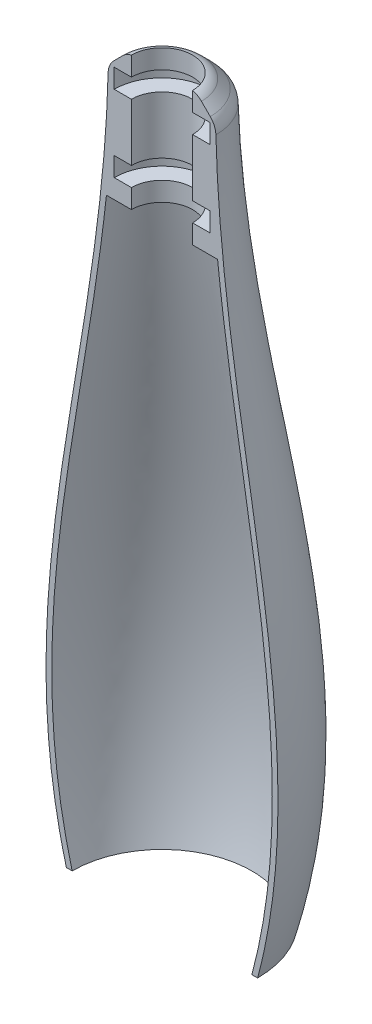
ISO-10303-21;
HEADER;
FILE_DESCRIPTION(('STEP AP214'),'2;1');
FILE_NAME('part.step','',(''),(''),'','','');
FILE_SCHEMA(('AUTOMOTIVE_DESIGN { 1 0 10303 214 1 1 1 1 }'));
ENDSEC;
DATA;
#1=APPLICATION_CONTEXT('core data for automotive mechanical design processes');
#2=APPLICATION_PROTOCOL_DEFINITION('international standard','automotive_design',2000,#1);
#3=PRODUCT_CONTEXT('',#1,'mechanical');
#4=PRODUCT('Part','Part','',(#3));
#5=PRODUCT_RELATED_PRODUCT_CATEGORY('part','',(#4));
#6=PRODUCT_DEFINITION_FORMATION('','',#4);
#7=PRODUCT_DEFINITION_CONTEXT('part definition',#1,'design');
#8=PRODUCT_DEFINITION('design','',#6,#7);
#9=PRODUCT_DEFINITION_SHAPE('','',#8);
#10=(LENGTH_UNIT() NAMED_UNIT(*) SI_UNIT(.MILLI.,.METRE.));
#11=(NAMED_UNIT(*) PLANE_ANGLE_UNIT() SI_UNIT($,.RADIAN.));
#12=(NAMED_UNIT(*) SI_UNIT($,.STERADIAN.) SOLID_ANGLE_UNIT());
#13=UNCERTAINTY_MEASURE_WITH_UNIT(LENGTH_MEASURE(1.E-05),#10,'distance_accuracy_value','');
#14=(GEOMETRIC_REPRESENTATION_CONTEXT(3) GLOBAL_UNCERTAINTY_ASSIGNED_CONTEXT((#13)) GLOBAL_UNIT_ASSIGNED_CONTEXT((#10,
#11,#12)) REPRESENTATION_CONTEXT('',''));
#15=CARTESIAN_POINT('',(0.,0.,0.));
#16=DIRECTION('',(0.,0.,1.));
#17=DIRECTION('',(1.,0.,0.));
#18=AXIS2_PLACEMENT_3D('',#15,#16,#17);
#19=CARTESIAN_POINT('',(0.,-350.,0.));
#20=DIRECTION('',(0.,-1.,0.));
#21=DIRECTION('',(1.,0.,0.));
#22=AXIS2_PLACEMENT_3D('',#19,#20,#21);
#23=PLANE('',#22);
#24=CARTESIAN_POINT('',(0.,-350.,0.));
#25=DIRECTION('',(0.,1.,0.));
#26=DIRECTION('',(-1.,0.,0.));
#27=AXIS2_PLACEMENT_3D('',#24,#25,#26);
#28=CIRCLE('',#27,50.);
#29=CARTESIAN_POINT('',(50.,-350.,0.));
#30=VERTEX_POINT('',#29);
#31=CARTESIAN_POINT('',(-50.,-350.,0.));
#32=VERTEX_POINT('',#31);
#33=EDGE_CURVE('E161',#30,#32,#28,.T.);
#34=ORIENTED_EDGE('',*,*,#33,.F.);
#35=DIRECTION('',(-1.,0.,0.));
#36=VECTOR('',#35,1.);
#37=CARTESIAN_POINT('',(70.,-350.,0.));
#38=LINE('',#37,#36);
#39=CARTESIAN_POINT('',(47.,-350.,0.));
#40=VERTEX_POINT('',#39);
#41=EDGE_CURVE('E153',#30,#40,#38,.T.);
#42=ORIENTED_EDGE('',*,*,#41,.T.);
#43=CARTESIAN_POINT('',(0.,-350.,0.));
#44=DIRECTION('',(0.,1.,0.));
#45=DIRECTION('',(-1.,0.,0.));
#46=AXIS2_PLACEMENT_3D('',#43,#44,#45);
#47=CIRCLE('',#46,47.);
#48=CARTESIAN_POINT('',(-47.,-350.,0.));
#49=VERTEX_POINT('',#48);
#50=EDGE_CURVE('E166',#40,#49,#47,.T.);
#51=ORIENTED_EDGE('',*,*,#50,.T.);
#52=EDGE_CURVE('E169',#49,#32,#38,.T.);
#53=ORIENTED_EDGE('',*,*,#52,.T.);
#54=EDGE_LOOP('',(#34,#42,#51,#53));
#55=FACE_BOUND('',#54,.T.);
#56=ADVANCED_FACE('F34',(#55),#23,.T.);
#57=CARTESIAN_POINT('',(-47.,-350.,0.));
#58=CARTESIAN_POINT('',(-74.6273831944322,-246.893202238206,0.));
#59=CARTESIAN_POINT('',(-41.1992508335811,-146.705952206088,0.));
#60=CARTESIAN_POINT('',(-29.0670337252442,-34.9999999999999,0.));
#61=B_SPLINE_CURVE_WITH_KNOTS('',3,(#57,#58,#59,#60),.UNSPECIFIED.,.F.,.F.,(4,4),(0.,
0.830416842574623),.UNSPECIFIED.);
#62=CARTESIAN_POINT('',(0.,50.,0.));
#63=DIRECTION('',(0.,1.,0.));
#64=AXIS1_PLACEMENT('',#62,#63);
#65=SURFACE_OF_REVOLUTION('',#61,#64);
#66=ORIENTED_EDGE('',*,*,#50,.F.);
#67=CARTESIAN_POINT('',(47.,-350.,0.));
#68=CARTESIAN_POINT('',(74.6273831944323,-246.893202238206,0.));
#69=CARTESIAN_POINT('',(41.1992508335812,-146.705952206088,0.));
#70=CARTESIAN_POINT('',(29.0670337252442,-34.9999999999999,0.));
#71=B_SPLINE_CURVE_WITH_KNOTS('',3,(#67,#68,#69,#70),.UNSPECIFIED.,.F.,.F.,(4,4),(0.,
0.830416842574623),.UNSPECIFIED.);
#72=CARTESIAN_POINT('',(29.0670337252442,-35.,0.));
#73=VERTEX_POINT('',#72);
#74=EDGE_CURVE('E149',#40,#73,#71,.T.);
#75=ORIENTED_EDGE('',*,*,#74,.T.);
#76=CARTESIAN_POINT('',(0.,-35.,0.));
#77=DIRECTION('',(0.,1.,0.));
#78=DIRECTION('',(-1.,0.,0.));
#79=AXIS2_PLACEMENT_3D('',#76,#77,#78);
#80=CIRCLE('',#79,29.0670337252442);
#81=CARTESIAN_POINT('',(-29.0670337252442,-35.,0.));
#82=VERTEX_POINT('',#81);
#83=EDGE_CURVE('E175',#73,#82,#80,.T.);
#84=ORIENTED_EDGE('',*,*,#83,.T.);
#85=CARTESIAN_POINT('',(-47.,-350.,0.));
#86=CARTESIAN_POINT('',(-74.6273831944322,-246.893202238206,0.));
#87=CARTESIAN_POINT('',(-41.1992508335811,-146.705952206088,0.));
#88=CARTESIAN_POINT('',(-29.0670337252442,-34.9999999999999,0.));
#89=B_SPLINE_CURVE_WITH_KNOTS('',3,(#85,#86,#87,#88),.UNSPECIFIED.,.F.,.F.,(4,4),(0.,
0.830416842574623),.UNSPECIFIED.);
#90=EDGE_CURVE('E173',#82,#49,#89,.F.);
#91=ORIENTED_EDGE('',*,*,#90,.T.);
#92=EDGE_LOOP('',(#66,#75,#84,#91));
#93=FACE_BOUND('',#92,.T.);
#94=ADVANCED_FACE('F172',(#93),#65,.F.);
#95=CARTESIAN_POINT('',(0.,-35.,0.));
#96=DIRECTION('',(0.,1.,0.));
#97=DIRECTION('',(-1.,0.,0.));
#98=AXIS2_PLACEMENT_3D('',#95,#96,#97);
#99=PLANE('',#98);
#100=DIRECTION('',(1.,0.,0.));
#101=VECTOR('',#100,1.);
#102=CARTESIAN_POINT('',(0.,-35.,0.));
#103=LINE('',#102,#101);
#104=CARTESIAN_POINT('',(-16.,-35.,0.));
#105=VERTEX_POINT('',#104);
#106=EDGE_CURVE('E255',#82,#105,#103,.T.);
#107=ORIENTED_EDGE('',*,*,#106,.F.);
#108=ORIENTED_EDGE('',*,*,#83,.F.);
#109=CARTESIAN_POINT('',(16.,-35.,0.));
#110=VERTEX_POINT('',#109);
#111=EDGE_CURVE('E156',#110,#73,#103,.T.);
#112=ORIENTED_EDGE('',*,*,#111,.F.);
#113=CARTESIAN_POINT('',(0.,-35.,0.));
#114=DIRECTION('',(0.,1.,0.));
#115=DIRECTION('',(-1.,0.,0.));
#116=AXIS2_PLACEMENT_3D('',#113,#114,#115);
#117=CIRCLE('',#116,16.);
#118=EDGE_CURVE('E180',#110,#105,#117,.T.);
#119=ORIENTED_EDGE('',*,*,#118,.T.);
#120=EDGE_LOOP('',(#107,#108,#112,#119));
#121=FACE_BOUND('',#120,.T.);
#122=ADVANCED_FACE('F254',(#121),#99,.F.);
#123=CARTESIAN_POINT('',(0.,50.,0.));
#124=DIRECTION('',(0.,1.,0.));
#125=DIRECTION('',(-1.,0.,0.));
#126=AXIS2_PLACEMENT_3D('',#123,#124,#125);
#127=CYLINDRICAL_SURFACE('',#126,16.);
#128=DIRECTION('',(0.,1.,0.));
#129=VECTOR('',#128,1.);
#130=CARTESIAN_POINT('',(16.,50.,0.));
#131=LINE('',#130,#129);
#132=CARTESIAN_POINT('',(16.,-25.,0.));
#133=VERTEX_POINT('',#132);
#134=EDGE_CURVE('E260',#133,#110,#131,.F.);
#135=ORIENTED_EDGE('',*,*,#134,.F.);
#136=CARTESIAN_POINT('',(0.,-25.,0.));
#137=DIRECTION('',(0.,1.,0.));
#138=DIRECTION('',(-1.,0.,0.));
#139=AXIS2_PLACEMENT_3D('',#136,#137,#138);
#140=CIRCLE('',#139,16.);
#141=CARTESIAN_POINT('',(-16.,-25.,0.));
#142=VERTEX_POINT('',#141);
#143=EDGE_CURVE('E248',#133,#142,#140,.T.);
#144=ORIENTED_EDGE('',*,*,#143,.T.);
#145=DIRECTION('',(0.,1.,0.));
#146=VECTOR('',#145,1.);
#147=CARTESIAN_POINT('',(-16.,50.,0.));
#148=LINE('',#147,#146);
#149=EDGE_CURVE('E262',#105,#142,#148,.T.);
#150=ORIENTED_EDGE('',*,*,#149,.F.);
#151=ORIENTED_EDGE('',*,*,#118,.F.);
#152=EDGE_LOOP('',(#135,#144,#150,#151));
#153=FACE_BOUND('',#152,.T.);
#154=ADVANCED_FACE('F259',(#153),#127,.F.);
#155=CARTESIAN_POINT('',(0.,-25.,0.));
#156=DIRECTION('',(0.,-1.,0.));
#157=DIRECTION('',(1.,0.,0.));
#158=AXIS2_PLACEMENT_3D('',#155,#156,#157);
#159=PLANE('',#158);
#160=DIRECTION('',(-1.,0.,0.));
#161=VECTOR('',#160,1.);
#162=CARTESIAN_POINT('',(0.,-25.,0.));
#163=LINE('',#162,#161);
#164=CARTESIAN_POINT('',(25.,-25.,0.));
#165=VERTEX_POINT('',#164);
#166=EDGE_CURVE('E270',#165,#133,#163,.T.);
#167=ORIENTED_EDGE('',*,*,#166,.F.);
#168=CARTESIAN_POINT('',(0.,-25.,0.));
#169=DIRECTION('',(0.,1.,0.));
#170=DIRECTION('',(-1.,0.,0.));
#171=AXIS2_PLACEMENT_3D('',#168,#169,#170);
#172=CIRCLE('',#171,25.);
#173=CARTESIAN_POINT('',(-25.,-25.,0.));
#174=VERTEX_POINT('',#173);
#175=EDGE_CURVE('E245',#165,#174,#172,.T.);
#176=ORIENTED_EDGE('',*,*,#175,.T.);
#177=EDGE_CURVE('E265',#142,#174,#163,.T.);
#178=ORIENTED_EDGE('',*,*,#177,.F.);
#179=ORIENTED_EDGE('',*,*,#143,.F.);
#180=EDGE_LOOP('',(#167,#176,#178,#179));
#181=FACE_BOUND('',#180,.T.);
#182=ADVANCED_FACE('F353',(#181),#159,.F.);
#183=CARTESIAN_POINT('',(0.,50.,0.));
#184=DIRECTION('',(0.,1.,0.));
#185=DIRECTION('',(-1.,0.,0.));
#186=AXIS2_PLACEMENT_3D('',#183,#184,#185);
#187=CYLINDRICAL_SURFACE('',#186,25.);
#188=DIRECTION('',(0.,1.,0.));
#189=VECTOR('',#188,1.);
#190=CARTESIAN_POINT('',(25.,50.,0.));
#191=LINE('',#190,#189);
#192=CARTESIAN_POINT('',(25.,-15.,0.));
#193=VERTEX_POINT('',#192);
#194=EDGE_CURVE('E285',#193,#165,#191,.F.);
#195=ORIENTED_EDGE('',*,*,#194,.F.);
#196=CARTESIAN_POINT('',(0.,-15.,0.));
#197=DIRECTION('',(0.,1.,0.));
#198=DIRECTION('',(-1.,0.,0.));
#199=AXIS2_PLACEMENT_3D('',#196,#197,#198);
#200=CIRCLE('',#199,25.);
#201=CARTESIAN_POINT('',(-25.,-15.,0.));
#202=VERTEX_POINT('',#201);
#203=EDGE_CURVE('E242',#193,#202,#200,.T.);
#204=ORIENTED_EDGE('',*,*,#203,.T.);
#205=DIRECTION('',(0.,1.,0.));
#206=VECTOR('',#205,1.);
#207=CARTESIAN_POINT('',(-25.,50.,0.));
#208=LINE('',#207,#206);
#209=EDGE_CURVE('E268',#174,#202,#208,.T.);
#210=ORIENTED_EDGE('',*,*,#209,.F.);
#211=ORIENTED_EDGE('',*,*,#175,.F.);
#212=EDGE_LOOP('',(#195,#204,#210,#211));
#213=FACE_BOUND('',#212,.T.);
#214=ADVANCED_FACE('F349',(#213),#187,.F.);
#215=CARTESIAN_POINT('',(0.,-15.,0.));
#216=DIRECTION('',(0.,1.,0.));
#217=DIRECTION('',(-1.,0.,0.));
#218=AXIS2_PLACEMENT_3D('',#215,#216,#217);
#219=PLANE('',#218);
#220=DIRECTION('',(1.,0.,0.));
#221=VECTOR('',#220,1.);
#222=CARTESIAN_POINT('',(0.,-15.,0.));
#223=LINE('',#222,#221);
#224=CARTESIAN_POINT('',(-16.,-15.,0.));
#225=VERTEX_POINT('',#224);
#226=EDGE_CURVE('E474',#202,#225,#223,.T.);
#227=ORIENTED_EDGE('',*,*,#226,.F.);
#228=ORIENTED_EDGE('',*,*,#203,.F.);
#229=CARTESIAN_POINT('',(16.,-15.,0.));
#230=VERTEX_POINT('',#229);
#231=EDGE_CURVE('E284',#230,#193,#223,.T.);
#232=ORIENTED_EDGE('',*,*,#231,.F.);
#233=CARTESIAN_POINT('',(0.,-15.,0.));
#234=DIRECTION('',(0.,1.,0.));
#235=DIRECTION('',(-1.,0.,0.));
#236=AXIS2_PLACEMENT_3D('',#233,#234,#235);
#237=CIRCLE('',#236,16.);
#238=EDGE_CURVE('E239',#230,#225,#237,.T.);
#239=ORIENTED_EDGE('',*,*,#238,.T.);
#240=EDGE_LOOP('',(#227,#228,#232,#239));
#241=FACE_BOUND('',#240,.T.);
#242=ADVANCED_FACE('F345',(#241),#219,.F.);
#243=CARTESIAN_POINT('',(0.,50.,0.));
#244=DIRECTION('',(0.,1.,0.));
#245=DIRECTION('',(-1.,0.,0.));
#246=AXIS2_PLACEMENT_3D('',#243,#244,#245);
#247=CYLINDRICAL_SURFACE('',#246,16.);
#248=DIRECTION('',(0.,1.,0.));
#249=VECTOR('',#248,1.);
#250=CARTESIAN_POINT('',(16.,50.,0.));
#251=LINE('',#250,#249);
#252=CARTESIAN_POINT('',(16.,15.,0.));
#253=VERTEX_POINT('',#252);
#254=EDGE_CURVE('E282',#253,#230,#251,.F.);
#255=ORIENTED_EDGE('',*,*,#254,.F.);
#256=CARTESIAN_POINT('',(0.,15.,0.));
#257=DIRECTION('',(0.,1.,0.));
#258=DIRECTION('',(-1.,0.,0.));
#259=AXIS2_PLACEMENT_3D('',#256,#257,#258);
#260=CIRCLE('',#259,16.);
#261=CARTESIAN_POINT('',(-16.,15.,0.));
#262=VERTEX_POINT('',#261);
#263=EDGE_CURVE('E236',#253,#262,#260,.T.);
#264=ORIENTED_EDGE('',*,*,#263,.T.);
#265=DIRECTION('',(0.,1.,0.));
#266=VECTOR('',#265,1.);
#267=CARTESIAN_POINT('',(-16.,50.,0.));
#268=LINE('',#267,#266);
#269=EDGE_CURVE('E475',#225,#262,#268,.T.);
#270=ORIENTED_EDGE('',*,*,#269,.F.);
#271=ORIENTED_EDGE('',*,*,#238,.F.);
#272=EDGE_LOOP('',(#255,#264,#270,#271));
#273=FACE_BOUND('',#272,.T.);
#274=ADVANCED_FACE('F341',(#273),#247,.F.);
#275=CARTESIAN_POINT('',(0.,15.,0.));
#276=DIRECTION('',(0.,-1.,0.));
#277=DIRECTION('',(1.,0.,0.));
#278=AXIS2_PLACEMENT_3D('',#275,#276,#277);
#279=PLANE('',#278);
#280=DIRECTION('',(-1.,0.,0.));
#281=VECTOR('',#280,1.);
#282=CARTESIAN_POINT('',(0.,15.,0.));
#283=LINE('',#282,#281);
#284=CARTESIAN_POINT('',(25.,15.,0.));
#285=VERTEX_POINT('',#284);
#286=EDGE_CURVE('E281',#285,#253,#283,.T.);
#287=ORIENTED_EDGE('',*,*,#286,.F.);
#288=CARTESIAN_POINT('',(0.,15.,0.));
#289=DIRECTION('',(0.,1.,0.));
#290=DIRECTION('',(-1.,0.,0.));
#291=AXIS2_PLACEMENT_3D('',#288,#289,#290);
#292=CIRCLE('',#291,25.);
#293=CARTESIAN_POINT('',(-25.,15.,0.));
#294=VERTEX_POINT('',#293);
#295=EDGE_CURVE('E233',#285,#294,#292,.T.);
#296=ORIENTED_EDGE('',*,*,#295,.T.);
#297=EDGE_CURVE('E479',#262,#294,#283,.T.);
#298=ORIENTED_EDGE('',*,*,#297,.F.);
#299=ORIENTED_EDGE('',*,*,#263,.F.);
#300=EDGE_LOOP('',(#287,#296,#298,#299));
#301=FACE_BOUND('',#300,.T.);
#302=ADVANCED_FACE('F337',(#301),#279,.F.);
#303=CARTESIAN_POINT('',(0.,50.,0.));
#304=DIRECTION('',(0.,1.,0.));
#305=DIRECTION('',(-1.,0.,0.));
#306=AXIS2_PLACEMENT_3D('',#303,#304,#305);
#307=CYLINDRICAL_SURFACE('',#306,25.);
#308=DIRECTION('',(0.,1.,0.));
#309=VECTOR('',#308,1.);
#310=CARTESIAN_POINT('',(25.,50.,0.));
#311=LINE('',#310,#309);
#312=CARTESIAN_POINT('',(25.,25.,0.));
#313=VERTEX_POINT('',#312);
#314=EDGE_CURVE('E279',#313,#285,#311,.F.);
#315=ORIENTED_EDGE('',*,*,#314,.F.);
#316=CARTESIAN_POINT('',(0.,25.,0.));
#317=DIRECTION('',(0.,1.,0.));
#318=DIRECTION('',(-1.,0.,0.));
#319=AXIS2_PLACEMENT_3D('',#316,#317,#318);
#320=CIRCLE('',#319,25.);
#321=CARTESIAN_POINT('',(-25.,25.,0.));
#322=VERTEX_POINT('',#321);
#323=EDGE_CURVE('E226',#313,#322,#320,.T.);
#324=ORIENTED_EDGE('',*,*,#323,.T.);
#325=DIRECTION('',(0.,1.,0.));
#326=VECTOR('',#325,1.);
#327=CARTESIAN_POINT('',(-25.,50.,0.));
#328=LINE('',#327,#326);
#329=EDGE_CURVE('E481',#294,#322,#328,.T.);
#330=ORIENTED_EDGE('',*,*,#329,.F.);
#331=ORIENTED_EDGE('',*,*,#295,.F.);
#332=EDGE_LOOP('',(#315,#324,#330,#331));
#333=FACE_BOUND('',#332,.T.);
#334=ADVANCED_FACE('F333',(#333),#307,.F.);
#335=CARTESIAN_POINT('',(0.,25.,0.));
#336=DIRECTION('',(0.,1.,0.));
#337=DIRECTION('',(-1.,0.,0.));
#338=AXIS2_PLACEMENT_3D('',#335,#336,#337);
#339=PLANE('',#338);
#340=DIRECTION('',(1.,0.,0.));
#341=VECTOR('',#340,1.);
#342=CARTESIAN_POINT('',(0.,25.,0.));
#343=LINE('',#342,#341);
#344=CARTESIAN_POINT('',(-16.,25.,0.));
#345=VERTEX_POINT('',#344);
#346=EDGE_CURVE('E483',#322,#345,#343,.T.);
#347=ORIENTED_EDGE('',*,*,#346,.F.);
#348=ORIENTED_EDGE('',*,*,#323,.F.);
#349=CARTESIAN_POINT('',(16.,25.,0.));
#350=VERTEX_POINT('',#349);
#351=EDGE_CURVE('E221',#350,#313,#343,.T.);
#352=ORIENTED_EDGE('',*,*,#351,.F.);
#353=CARTESIAN_POINT('',(0.,25.,0.));
#354=DIRECTION('',(0.,1.,0.));
#355=DIRECTION('',(-1.,0.,0.));
#356=AXIS2_PLACEMENT_3D('',#353,#354,#355);
#357=CIRCLE('',#356,16.);
#358=EDGE_CURVE('E220',#350,#345,#357,.T.);
#359=ORIENTED_EDGE('',*,*,#358,.T.);
#360=EDGE_LOOP('',(#347,#348,#352,#359));
#361=FACE_BOUND('',#360,.T.);
#362=ADVANCED_FACE('F328',(#361),#339,.F.);
#363=CARTESIAN_POINT('',(0.,50.,0.));
#364=DIRECTION('',(0.,1.,0.));
#365=DIRECTION('',(-1.,0.,0.));
#366=AXIS2_PLACEMENT_3D('',#363,#364,#365);
#367=CYLINDRICAL_SURFACE('',#366,16.);
#368=DIRECTION('',(0.,1.,0.));
#369=VECTOR('',#368,1.);
#370=CARTESIAN_POINT('',(16.,50.,0.));
#371=LINE('',#370,#369);
#372=CARTESIAN_POINT('',(16.,35.,0.));
#373=VERTEX_POINT('',#372);
#374=EDGE_CURVE('E209',#373,#350,#371,.F.);
#375=ORIENTED_EDGE('',*,*,#374,.F.);
#376=CARTESIAN_POINT('',(0.,35.,0.));
#377=DIRECTION('',(0.,1.,0.));
#378=DIRECTION('',(-1.,0.,0.));
#379=AXIS2_PLACEMENT_3D('',#376,#377,#378);
#380=CIRCLE('',#379,16.);
#381=CARTESIAN_POINT('',(-16.,35.,0.));
#382=VERTEX_POINT('',#381);
#383=EDGE_CURVE('E218',#373,#382,#380,.T.);
#384=ORIENTED_EDGE('',*,*,#383,.T.);
#385=DIRECTION('',(0.,1.,0.));
#386=VECTOR('',#385,1.);
#387=CARTESIAN_POINT('',(-16.,50.,0.));
#388=LINE('',#387,#386);
#389=EDGE_CURVE('E168',#345,#382,#388,.T.);
#390=ORIENTED_EDGE('',*,*,#389,.F.);
#391=ORIENTED_EDGE('',*,*,#358,.F.);
#392=EDGE_LOOP('',(#375,#384,#390,#391));
#393=FACE_BOUND('',#392,.T.);
#394=ADVANCED_FACE('F216',(#393),#367,.F.);
#395=CARTESIAN_POINT('',(-28.,35.,0.));
#396=CARTESIAN_POINT('',(-28.0000000000005,-105.908330090144,0.));
#397=CARTESIAN_POINT('',(-83.2692953442221,-225.837299443347,0.));
#398=CARTESIAN_POINT('',(-50.,-350.,0.));
#399=B_SPLINE_CURVE_WITH_KNOTS('',3,(#395,#396,#397,#398),.UNSPECIFIED.,.F.,.F.,(4,4),(0.,1.),.UNSPECIFIED.);
#400=CARTESIAN_POINT('',(0.,50.,0.));
#401=DIRECTION('',(0.,1.,0.));
#402=AXIS1_PLACEMENT('',#400,#401);
#403=SURFACE_OF_REVOLUTION('',#399,#402);
#404=CARTESIAN_POINT('',(-28.,35.,0.));
#405=CARTESIAN_POINT('',(-28.0000000000005,-105.908330090144,0.));
#406=CARTESIAN_POINT('',(-83.2692953442221,-225.837299443347,0.));
#407=CARTESIAN_POINT('',(-50.,-350.,0.));
#408=B_SPLINE_CURVE_WITH_KNOTS('',3,(#404,#405,#406,#407),.UNSPECIFIED.,.F.,.F.,(4,4),(0.,1.),.UNSPECIFIED.);
#409=CARTESIAN_POINT('',(-28.1801771916522,20.9278801859438,0.));
#410=VERTEX_POINT('',#409);
#411=EDGE_CURVE('E174',#32,#410,#408,.F.);
#412=ORIENTED_EDGE('',*,*,#411,.T.);
#413=CARTESIAN_POINT('',(0.,20.9278801859424,0.));
#414=DIRECTION('',(0.,1.,0.));
#415=DIRECTION('',(-1.,0.,0.));
#416=AXIS2_PLACEMENT_3D('',#413,#414,#415);
#417=CIRCLE('',#416,28.1801771916523);
#418=CARTESIAN_POINT('',(28.1801771916522,20.9278801859439,0.));
#419=VERTEX_POINT('',#418);
#420=EDGE_CURVE('E11',#410,#419,#417,.F.);
#421=ORIENTED_EDGE('',*,*,#420,.T.);
#422=CARTESIAN_POINT('',(28.,35.,0.));
#423=CARTESIAN_POINT('',(28.0000000000005,-105.908330090144,0.));
#424=CARTESIAN_POINT('',(83.2692953442222,-225.837299443347,0.));
#425=CARTESIAN_POINT('',(50.,-350.,0.));
#426=B_SPLINE_CURVE_WITH_KNOTS('',3,(#422,#423,#424,#425),.UNSPECIFIED.,.F.,.F.,(4,4),(0.,1.),.UNSPECIFIED.);
#427=EDGE_CURVE('E178',#419,#30,#426,.T.);
#428=ORIENTED_EDGE('',*,*,#427,.T.);
#429=ORIENTED_EDGE('',*,*,#33,.T.);
#430=EDGE_LOOP('',(#412,#421,#428,#429));
#431=FACE_BOUND('',#430,.T.);
#432=ADVANCED_FACE('F320',(#431),#403,.F.);
#433=CARTESIAN_POINT('',(70.,-350.,0.));
#434=DIRECTION('',(0.,0.,1.));
#435=DIRECTION('',(1.,0.,0.));
#436=AXIS2_PLACEMENT_3D('',#433,#434,#435);
#437=PLANE('',#436);
#438=ORIENTED_EDGE('',*,*,#389,.T.);
#439=CARTESIAN_POINT('',(-13.5541405440405,25.3037238322285,0.));
#440=DIRECTION('',(0.,0.,1.));
#441=DIRECTION('',(1.,0.,0.));
#442=AXIS2_PLACEMENT_3D('',#439,#440,#441);
#443=CIRCLE('',#442,10.);
#444=CARTESIAN_POINT('',(-20.625208355906,32.374791644094,0.));
#445=VERTEX_POINT('',#444);
#446=EDGE_CURVE('E202',#382,#445,#443,.T.);
#447=ORIENTED_EDGE('',*,*,#446,.T.);
#448=DIRECTION('',(-0.70710678118655,-0.707106781186545,0.));
#449=VECTOR('',#448,1.);
#450=CARTESIAN_POINT('',(0.,52.9999999999998,0.));
#451=LINE('',#450,#449);
#452=CARTESIAN_POINT('',(-25.2544562035719,27.7455437964281,0.));
#453=VERTEX_POINT('',#452);
#454=EDGE_CURVE('E192',#445,#453,#451,.T.);
#455=ORIENTED_EDGE('',*,*,#454,.T.);
#456=CARTESIAN_POINT('',(-18.1833883917064,20.6744759845626,0.));
#457=DIRECTION('',(0.,0.,1.));
#458=DIRECTION('',(1.,0.,0.));
#459=AXIS2_PLACEMENT_3D('',#456,#457,#458);
#460=CIRCLE('',#459,10.);
#461=EDGE_CURVE('E200',#453,#410,#460,.T.);
#462=ORIENTED_EDGE('',*,*,#461,.T.);
#463=ORIENTED_EDGE('',*,*,#411,.F.);
#464=ORIENTED_EDGE('',*,*,#52,.F.);
#465=ORIENTED_EDGE('',*,*,#90,.F.);
#466=ORIENTED_EDGE('',*,*,#106,.T.);
#467=ORIENTED_EDGE('',*,*,#149,.T.);
#468=ORIENTED_EDGE('',*,*,#177,.T.);
#469=ORIENTED_EDGE('',*,*,#209,.T.);
#470=ORIENTED_EDGE('',*,*,#226,.T.);
#471=ORIENTED_EDGE('',*,*,#269,.T.);
#472=ORIENTED_EDGE('',*,*,#297,.T.);
#473=ORIENTED_EDGE('',*,*,#329,.T.);
#474=ORIENTED_EDGE('',*,*,#346,.T.);
#475=EDGE_LOOP('',(#438,#447,#455,#462,#463,#464,#465,#466,#467,#468,#469,#470,#471,#472,#473,#474));
#476=FACE_BOUND('',#475,.T.);
#477=ADVANCED_FACE('F318',(#476),#437,.T.);
#478=DIRECTION('',(-0.70710678118655,0.707106781186545,0.));
#479=VECTOR('',#478,1.);
#480=CARTESIAN_POINT('',(0.,52.9999999999998,0.));
#481=LINE('',#480,#479);
#482=CARTESIAN_POINT('',(25.2544562035719,27.7455437964281,0.));
#483=VERTEX_POINT('',#482);
#484=CARTESIAN_POINT('',(20.625208355906,32.374791644094,0.));
#485=VERTEX_POINT('',#484);
#486=EDGE_CURVE('E198',#483,#485,#481,.T.);
#487=ORIENTED_EDGE('',*,*,#486,.T.);
#488=CARTESIAN_POINT('',(13.5541405440405,25.3037238322285,0.));
#489=DIRECTION('',(0.,0.,1.));
#490=DIRECTION('',(1.,0.,0.));
#491=AXIS2_PLACEMENT_3D('',#488,#489,#490);
#492=CIRCLE('',#491,10.);
#493=EDGE_CURVE('E42',#485,#373,#492,.T.);
#494=ORIENTED_EDGE('',*,*,#493,.T.);
#495=ORIENTED_EDGE('',*,*,#374,.T.);
#496=ORIENTED_EDGE('',*,*,#351,.T.);
#497=ORIENTED_EDGE('',*,*,#314,.T.);
#498=ORIENTED_EDGE('',*,*,#286,.T.);
#499=ORIENTED_EDGE('',*,*,#254,.T.);
#500=ORIENTED_EDGE('',*,*,#231,.T.);
#501=ORIENTED_EDGE('',*,*,#194,.T.);
#502=ORIENTED_EDGE('',*,*,#166,.T.);
#503=ORIENTED_EDGE('',*,*,#134,.T.);
#504=ORIENTED_EDGE('',*,*,#111,.T.);
#505=ORIENTED_EDGE('',*,*,#74,.F.);
#506=ORIENTED_EDGE('',*,*,#41,.F.);
#507=ORIENTED_EDGE('',*,*,#427,.F.);
#508=CARTESIAN_POINT('',(18.1833883917064,20.6744759845626,0.));
#509=DIRECTION('',(0.,0.,1.));
#510=DIRECTION('',(1.,0.,0.));
#511=AXIS2_PLACEMENT_3D('',#508,#509,#510);
#512=CIRCLE('',#511,10.);
#513=EDGE_CURVE('E49',#419,#483,#512,.T.);
#514=ORIENTED_EDGE('',*,*,#513,.T.);
#515=EDGE_LOOP('',(#487,#494,#495,#496,#497,#498,#499,#500,#501,#502,#503,#504,#505,#506,#507,#514));
#516=FACE_BOUND('',#515,.T.);
#517=ADVANCED_FACE('F151',(#516),#437,.T.);
#518=CARTESIAN_POINT('',(0.,34.9999999999999,0.));
#519=DIRECTION('',(0.,-1.,0.));
#520=DIRECTION('',(1.,0.,0.));
#521=AXIS2_PLACEMENT_3D('',#518,#519,#520);
#522=CONICAL_SURFACE('',#521,18.,0.785398163397452);
#523=ORIENTED_EDGE('',*,*,#454,.F.);
#524=CARTESIAN_POINT('',(0.,32.374791644094,0.));
#525=DIRECTION('',(0.,-1.,0.));
#526=DIRECTION('',(1.,0.,0.));
#527=AXIS2_PLACEMENT_3D('',#524,#525,#526);
#528=CIRCLE('',#527,20.625208355906);
#529=EDGE_CURVE('E56',#445,#485,#528,.T.);
#530=ORIENTED_EDGE('',*,*,#529,.T.);
#531=ORIENTED_EDGE('',*,*,#486,.F.);
#532=CARTESIAN_POINT('',(0.,27.7455437964281,0.));
#533=DIRECTION('',(0.,1.,0.));
#534=DIRECTION('',(-1.,0.,0.));
#535=AXIS2_PLACEMENT_3D('',#532,#533,#534);
#536=CIRCLE('',#535,25.2544562035719);
#537=EDGE_CURVE('E204',#483,#453,#536,.T.);
#538=ORIENTED_EDGE('',*,*,#537,.T.);
#539=EDGE_LOOP('',(#523,#530,#531,#538));
#540=FACE_BOUND('',#539,.T.);
#541=ADVANCED_FACE('F309',(#540),#522,.T.);
#542=CARTESIAN_POINT('',(0.,25.3037238322285,0.));
#543=DIRECTION('',(0.,1.,0.));
#544=DIRECTION('',(-1.,0.,0.));
#545=AXIS2_PLACEMENT_3D('',#542,#543,#544);
#546=TOROIDAL_SURFACE('',#545,13.5541405440405,10.);
#547=ORIENTED_EDGE('',*,*,#493,.F.);
#548=ORIENTED_EDGE('',*,*,#529,.F.);
#549=ORIENTED_EDGE('',*,*,#446,.F.);
#550=ORIENTED_EDGE('',*,*,#383,.F.);
#551=EDGE_LOOP('',(#547,#548,#549,#550));
#552=FACE_BOUND('',#551,.T.);
#553=ADVANCED_FACE('F223',(#552),#546,.T.);
#554=CARTESIAN_POINT('',(0.,20.6744759845626,0.));
#555=DIRECTION('',(0.,1.,0.));
#556=DIRECTION('',(-1.,0.,0.));
#557=AXIS2_PLACEMENT_3D('',#554,#555,#556);
#558=TOROIDAL_SURFACE('',#557,18.1833883917064,10.);
#559=ORIENTED_EDGE('',*,*,#461,.F.);
#560=ORIENTED_EDGE('',*,*,#537,.F.);
#561=ORIENTED_EDGE('',*,*,#513,.F.);
#562=ORIENTED_EDGE('',*,*,#420,.F.);
#563=EDGE_LOOP('',(#559,#560,#561,#562));
#564=FACE_BOUND('',#563,.T.);
#565=ADVANCED_FACE('F36',(#564),#558,.T.);
#566=CLOSED_SHELL('',(#56,#94,#122,#154,#182,#214,#242,#274,#302,#334,#362,#394,#432,#477,#517,
#541,#553,#565));
#567=MANIFOLD_SOLID_BREP('B2',#566);
#568=ADVANCED_BREP_SHAPE_REPRESENTATION('',(#18,#567),#14);
#569=SHAPE_DEFINITION_REPRESENTATION(#9,#568);
ENDSEC;
END-ISO-10303-21;
